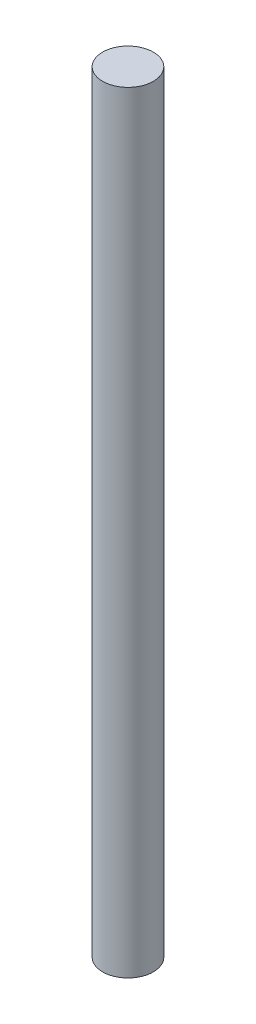
ISO-10303-21;
HEADER;
FILE_DESCRIPTION(('STEP AP214'),'2;1');
FILE_NAME('part.step','',(''),(''),'','','');
FILE_SCHEMA(('AUTOMOTIVE_DESIGN { 1 0 10303 214 1 1 1 1 }'));
ENDSEC;
DATA;
#1=APPLICATION_CONTEXT('core data for automotive mechanical design processes');
#2=APPLICATION_PROTOCOL_DEFINITION('international standard','automotive_design',2000,#1);
#3=PRODUCT_CONTEXT('',#1,'mechanical');
#4=PRODUCT('Part','Part','',(#3));
#5=PRODUCT_RELATED_PRODUCT_CATEGORY('part','',(#4));
#6=PRODUCT_DEFINITION_FORMATION('','',#4);
#7=PRODUCT_DEFINITION_CONTEXT('part definition',#1,'design');
#8=PRODUCT_DEFINITION('design','',#6,#7);
#9=PRODUCT_DEFINITION_SHAPE('','',#8);
#10=(LENGTH_UNIT() NAMED_UNIT(*) SI_UNIT(.MILLI.,.METRE.));
#11=(NAMED_UNIT(*) PLANE_ANGLE_UNIT() SI_UNIT($,.RADIAN.));
#12=(NAMED_UNIT(*) SI_UNIT($,.STERADIAN.) SOLID_ANGLE_UNIT());
#13=UNCERTAINTY_MEASURE_WITH_UNIT(LENGTH_MEASURE(1.E-05),#10,'distance_accuracy_value','');
#14=(GEOMETRIC_REPRESENTATION_CONTEXT(3) GLOBAL_UNCERTAINTY_ASSIGNED_CONTEXT((#13)) GLOBAL_UNIT_ASSIGNED_CONTEXT((#10,
#11,#12)) REPRESENTATION_CONTEXT('',''));
#15=CARTESIAN_POINT('',(0.,0.,0.));
#16=DIRECTION('',(0.,0.,1.));
#17=DIRECTION('',(1.,0.,0.));
#18=AXIS2_PLACEMENT_3D('',#15,#16,#17);
#19=CARTESIAN_POINT('',(0.,350.,0.));
#20=DIRECTION('',(0.,-1.,0.));
#21=DIRECTION('',(0.,0.,-1.));
#22=AXIS2_PLACEMENT_3D('',#19,#20,#21);
#23=CYLINDRICAL_SURFACE('',#22,11.5);
#24=CARTESIAN_POINT('',(0.,350.,0.));
#25=DIRECTION('',(0.,1.,0.));
#26=DIRECTION('',(0.,0.,1.));
#27=AXIS2_PLACEMENT_3D('',#24,#25,#26);
#28=CIRCLE('',#27,11.5);
#29=CARTESIAN_POINT('',(0.,350.,11.5));
#30=VERTEX_POINT('',#29);
#31=EDGE_CURVE('E10',#30,#30,#28,.T.);
#32=ORIENTED_EDGE('',*,*,#31,.F.);
#33=EDGE_LOOP('',(#32));
#34=FACE_BOUND('',#33,.T.);
#35=CARTESIAN_POINT('',(0.,0.,0.));
#36=DIRECTION('',(0.,1.,0.));
#37=DIRECTION('',(0.,0.,1.));
#38=AXIS2_PLACEMENT_3D('',#35,#36,#37);
#39=CIRCLE('',#38,11.5);
#40=CARTESIAN_POINT('',(0.,0.,11.5));
#41=VERTEX_POINT('',#40);
#42=EDGE_CURVE('E34',#41,#41,#39,.T.);
#43=ORIENTED_EDGE('',*,*,#42,.T.);
#44=EDGE_LOOP('',(#43));
#45=FACE_BOUND('',#44,.T.);
#46=ADVANCED_FACE('F31',(#34,#45),#23,.T.);
#47=CARTESIAN_POINT('',(0.,350.,0.));
#48=DIRECTION('',(0.,1.,0.));
#49=DIRECTION('',(0.,0.,1.));
#50=AXIS2_PLACEMENT_3D('',#47,#48,#49);
#51=PLANE('',#50);
#52=ORIENTED_EDGE('',*,*,#31,.T.);
#53=EDGE_LOOP('',(#52));
#54=FACE_BOUND('',#53,.T.);
#55=ADVANCED_FACE('F46',(#54),#51,.T.);
#56=CARTESIAN_POINT('',(0.,0.,0.));
#57=DIRECTION('',(0.,1.,0.));
#58=DIRECTION('',(0.,0.,1.));
#59=AXIS2_PLACEMENT_3D('',#56,#57,#58);
#60=PLANE('',#59);
#61=ORIENTED_EDGE('',*,*,#42,.F.);
#62=EDGE_LOOP('',(#61));
#63=FACE_BOUND('',#62,.T.);
#64=ADVANCED_FACE('F44',(#63),#60,.F.);
#65=CLOSED_SHELL('',(#46,#55,#64));
#66=MANIFOLD_SOLID_BREP('B2',#65);
#67=ADVANCED_BREP_SHAPE_REPRESENTATION('',(#18,#66),#14);
#68=SHAPE_DEFINITION_REPRESENTATION(#9,#67);
ENDSEC;
END-ISO-10303-21;
